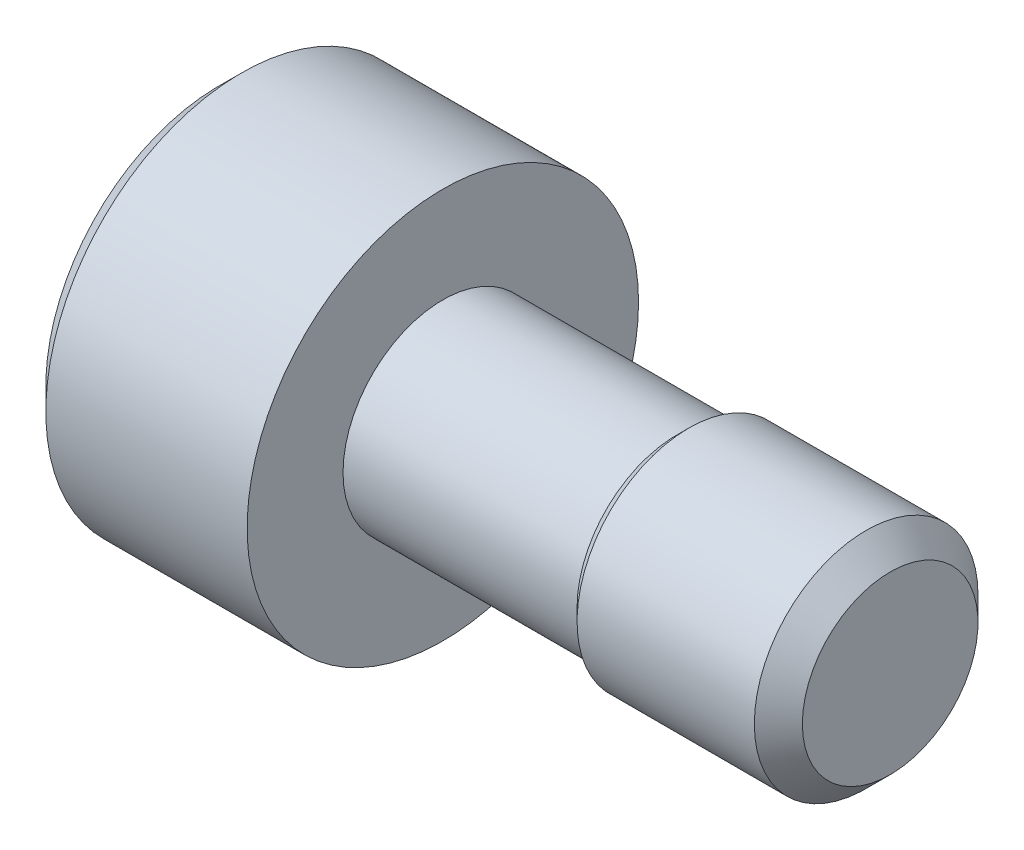
ISO-10303-21;
HEADER;
FILE_DESCRIPTION(('STEP AP214'),'2;1');
FILE_NAME('part.step','',(''),(''),'','','');
FILE_SCHEMA(('AUTOMOTIVE_DESIGN { 1 0 10303 214 1 1 1 1 }'));
ENDSEC;
DATA;
#1=APPLICATION_CONTEXT('core data for automotive mechanical design processes');
#2=APPLICATION_PROTOCOL_DEFINITION('international standard','automotive_design',2000,#1);
#3=PRODUCT_CONTEXT('',#1,'mechanical');
#4=PRODUCT('Part','Part','',(#3));
#5=PRODUCT_RELATED_PRODUCT_CATEGORY('part','',(#4));
#6=PRODUCT_DEFINITION_FORMATION('','',#4);
#7=PRODUCT_DEFINITION_CONTEXT('part definition',#1,'design');
#8=PRODUCT_DEFINITION('design','',#6,#7);
#9=PRODUCT_DEFINITION_SHAPE('','',#8);
#10=(LENGTH_UNIT() NAMED_UNIT(*) SI_UNIT(.MILLI.,.METRE.));
#11=(NAMED_UNIT(*) PLANE_ANGLE_UNIT() SI_UNIT($,.RADIAN.));
#12=(NAMED_UNIT(*) SI_UNIT($,.STERADIAN.) SOLID_ANGLE_UNIT());
#13=UNCERTAINTY_MEASURE_WITH_UNIT(LENGTH_MEASURE(1.E-05),#10,'distance_accuracy_value','');
#14=(GEOMETRIC_REPRESENTATION_CONTEXT(3) GLOBAL_UNCERTAINTY_ASSIGNED_CONTEXT((#13)) GLOBAL_UNIT_ASSIGNED_CONTEXT((#10,
#11,#12)) REPRESENTATION_CONTEXT('',''));
#15=CARTESIAN_POINT('',(0.,0.,0.));
#16=DIRECTION('',(0.,0.,1.));
#17=DIRECTION('',(1.,0.,0.));
#18=AXIS2_PLACEMENT_3D('',#15,#16,#17);
#19=CARTESIAN_POINT('',(8.,0.78525,0.));
#20=DIRECTION('',(1.,0.,0.));
#21=DIRECTION('',(0.,0.,-1.));
#22=AXIS2_PLACEMENT_3D('',#19,#20,#21);
#23=PLANE('',#22);
#24=CARTESIAN_POINT('',(7.99999999992451,0.,0.));
#25=DIRECTION('',(-1.,0.,0.));
#26=DIRECTION('',(0.,0.,1.));
#27=AXIS2_PLACEMENT_3D('',#24,#25,#26);
#28=CIRCLE('',#27,1.57050000001391);
#29=CARTESIAN_POINT('',(7.99999999992451,0.,1.57050000001391));
#30=VERTEX_POINT('',#29);
#31=EDGE_CURVE('E127',#30,#30,#28,.T.);
#32=ORIENTED_EDGE('',*,*,#31,.F.);
#33=EDGE_LOOP('',(#32));
#34=FACE_BOUND('',#33,.T.);
#35=ADVANCED_FACE('F17',(#34),#23,.T.);
#36=CARTESIAN_POINT('',(-2.,0.,0.));
#37=DIRECTION('',(1.,0.,0.));
#38=DIRECTION('',(0.,0.,-1.));
#39=AXIS2_PLACEMENT_3D('',#36,#37,#38);
#40=PLANE('',#39);
#41=DIRECTION('',(0.,1.,0.));
#42=VECTOR('',#41,1.);
#43=CARTESIAN_POINT('',(-2.,0.866025403784439,-1.5));
#44=LINE('',#43,#42);
#45=CARTESIAN_POINT('',(-2.00000000004199,0.,-1.50000000001069));
#46=VERTEX_POINT('',#45);
#47=CARTESIAN_POINT('',(-2.,-0.866025403784439,-1.5));
#48=VERTEX_POINT('',#47);
#49=EDGE_CURVE('E108',#46,#48,#44,.F.);
#50=ORIENTED_EDGE('',*,*,#49,.T.);
#51=DIRECTION('',(0.,0.5,-0.866025403784439));
#52=VECTOR('',#51,1.);
#53=CARTESIAN_POINT('',(-2.,-0.866025403784439,-1.5));
#54=LINE('',#53,#52);
#55=CARTESIAN_POINT('',(-2.00000000004199,-1.29903810568591,-0.750000000005343));
#56=VERTEX_POINT('',#55);
#57=EDGE_CURVE('E104',#48,#56,#54,.F.);
#58=ORIENTED_EDGE('',*,*,#57,.T.);
#59=CARTESIAN_POINT('',(-2.00000000008398,0.,0.));
#60=DIRECTION('',(-1.,0.,0.));
#61=DIRECTION('',(0.,0.,1.));
#62=AXIS2_PLACEMENT_3D('',#59,#60,#61);
#63=CIRCLE('',#62,1.50000000002137);
#64=EDGE_CURVE('E20',#56,#46,#63,.F.);
#65=ORIENTED_EDGE('',*,*,#64,.T.);
#66=EDGE_LOOP('',(#50,#58,#65));
#67=FACE_BOUND('',#66,.T.);
#68=ADVANCED_FACE('F105',(#67),#40,.F.);
#69=CARTESIAN_POINT('',(-2.,0.,0.));
#70=DIRECTION('',(1.,0.,0.));
#71=DIRECTION('',(0.,0.,-1.));
#72=AXIS2_PLACEMENT_3D('',#69,#70,#71);
#73=PLANE('',#72);
#74=DIRECTION('',(0.,0.5,0.866025403784439));
#75=VECTOR('',#74,1.);
#76=CARTESIAN_POINT('',(-2.,1.73205080756888,0.));
#77=LINE('',#76,#75);
#78=CARTESIAN_POINT('',(-2.00000000004199,1.29903810568591,-0.750000000005343));
#79=VERTEX_POINT('',#78);
#80=CARTESIAN_POINT('',(-2.,0.866025403784441,-1.5));
#81=VERTEX_POINT('',#80);
#82=EDGE_CURVE('E156',#79,#81,#77,.F.);
#83=ORIENTED_EDGE('',*,*,#82,.T.);
#84=DIRECTION('',(0.,1.,0.));
#85=VECTOR('',#84,1.);
#86=CARTESIAN_POINT('',(-2.,0.866025403784439,-1.5));
#87=LINE('',#86,#85);
#88=EDGE_CURVE('E124',#81,#46,#87,.F.);
#89=ORIENTED_EDGE('',*,*,#88,.T.);
#90=CARTESIAN_POINT('',(-2.00000000008398,0.,0.));
#91=DIRECTION('',(-1.,0.,0.));
#92=DIRECTION('',(0.,0.,1.));
#93=AXIS2_PLACEMENT_3D('',#90,#91,#92);
#94=CIRCLE('',#93,1.50000000002137);
#95=EDGE_CURVE('E122',#79,#46,#94,.T.);
#96=ORIENTED_EDGE('',*,*,#95,.F.);
#97=EDGE_LOOP('',(#83,#89,#96));
#98=FACE_BOUND('',#97,.T.);
#99=ADVANCED_FACE('F226',(#98),#73,.F.);
#100=CARTESIAN_POINT('',(-4.,0.866025403784439,-1.5));
#101=DIRECTION('',(0.,0.,-1.));
#102=DIRECTION('',(-1.,0.,0.));
#103=AXIS2_PLACEMENT_3D('',#100,#101,#102);
#104=PLANE('',#103);
#105=DIRECTION('',(1.,0.,0.));
#106=VECTOR('',#105,1.);
#107=CARTESIAN_POINT('',(-4.,-0.866025403784439,-1.5));
#108=LINE('',#107,#106);
#109=CARTESIAN_POINT('',(-4.,-0.866025403784439,-1.5));
#110=VERTEX_POINT('',#109);
#111=EDGE_CURVE('E113',#110,#48,#108,.T.);
#112=ORIENTED_EDGE('',*,*,#111,.T.);
#113=ORIENTED_EDGE('',*,*,#49,.F.);
#114=ORIENTED_EDGE('',*,*,#88,.F.);
#115=DIRECTION('',(1.,0.,0.));
#116=VECTOR('',#115,1.);
#117=CARTESIAN_POINT('',(-4.,0.866025403784441,-1.5));
#118=LINE('',#117,#116);
#119=CARTESIAN_POINT('',(-4.,0.86602540378444,-1.5));
#120=VERTEX_POINT('',#119);
#121=EDGE_CURVE('E151',#81,#120,#118,.F.);
#122=ORIENTED_EDGE('',*,*,#121,.T.);
#123=DIRECTION('',(0.,1.,0.));
#124=VECTOR('',#123,1.);
#125=CARTESIAN_POINT('',(-4.,0.866025403784439,-1.5));
#126=LINE('',#125,#124);
#127=EDGE_CURVE('E129',#110,#120,#126,.T.);
#128=ORIENTED_EDGE('',*,*,#127,.F.);
#129=EDGE_LOOP('',(#112,#113,#114,#122,#128));
#130=FACE_BOUND('',#129,.T.);
#131=ADVANCED_FACE('F217',(#130),#104,.F.);
#132=CARTESIAN_POINT('',(7.57050000004256,0.,0.));
#133=DIRECTION('',(-1.,0.,0.));
#134=DIRECTION('',(0.,0.,1.));
#135=AXIS2_PLACEMENT_3D('',#132,#133,#134);
#136=CONICAL_SURFACE('',#135,1.99999999995271,0.785398163463622);
#137=CARTESIAN_POINT('',(7.5705,0.,0.));
#138=DIRECTION('',(1.,0.,0.));
#139=DIRECTION('',(0.,0.,-1.));
#140=AXIS2_PLACEMENT_3D('',#137,#138,#139);
#141=CIRCLE('',#140,2.);
#142=CARTESIAN_POINT('',(7.5705,0.,-2.));
#143=VERTEX_POINT('',#142);
#144=EDGE_CURVE('E150',#143,#143,#141,.F.);
#145=ORIENTED_EDGE('',*,*,#144,.F.);
#146=EDGE_LOOP('',(#145));
#147=FACE_BOUND('',#146,.T.);
#148=ORIENTED_EDGE('',*,*,#31,.T.);
#149=EDGE_LOOP('',(#148));
#150=FACE_BOUND('',#149,.T.);
#151=ADVANCED_FACE('F214',(#147,#150),#136,.T.);
#152=CARTESIAN_POINT('',(-4.,-0.866025403784439,-1.5));
#153=DIRECTION('',(0.,-0.866025403784439,-0.5));
#154=DIRECTION('',(0.,0.5,-0.866025403784439));
#155=AXIS2_PLACEMENT_3D('',#152,#153,#154);
#156=PLANE('',#155);
#157=DIRECTION('',(1.,0.,0.));
#158=VECTOR('',#157,1.);
#159=CARTESIAN_POINT('',(-4.,-1.73205080756888,0.));
#160=LINE('',#159,#158);
#161=CARTESIAN_POINT('',(-4.,-1.73205080756888,0.));
#162=VERTEX_POINT('',#161);
#163=CARTESIAN_POINT('',(-2.,-1.73205080756888,0.));
#164=VERTEX_POINT('',#163);
#165=EDGE_CURVE('E117',#162,#164,#160,.T.);
#166=ORIENTED_EDGE('',*,*,#165,.T.);
#167=DIRECTION('',(0.,0.500000000000001,-0.866025403784438));
#168=VECTOR('',#167,1.);
#169=CARTESIAN_POINT('',(-2.,-1.73205080756888,0.));
#170=LINE('',#169,#168);
#171=EDGE_CURVE('E92',#164,#56,#170,.T.);
#172=ORIENTED_EDGE('',*,*,#171,.T.);
#173=ORIENTED_EDGE('',*,*,#57,.F.);
#174=ORIENTED_EDGE('',*,*,#111,.F.);
#175=DIRECTION('',(0.,0.5,-0.866025403784439));
#176=VECTOR('',#175,1.);
#177=CARTESIAN_POINT('',(-4.,-0.866025403784439,-1.5));
#178=LINE('',#177,#176);
#179=EDGE_CURVE('E112',#162,#110,#178,.T.);
#180=ORIENTED_EDGE('',*,*,#179,.F.);
#181=EDGE_LOOP('',(#166,#172,#173,#174,#180));
#182=FACE_BOUND('',#181,.T.);
#183=ADVANCED_FACE('F115',(#182),#156,.F.);
#184=CARTESIAN_POINT('',(-2.,0.,0.));
#185=DIRECTION('',(1.,0.,0.));
#186=DIRECTION('',(0.,0.,-1.));
#187=AXIS2_PLACEMENT_3D('',#184,#185,#186);
#188=PLANE('',#187);
#189=ORIENTED_EDGE('',*,*,#171,.F.);
#190=DIRECTION('',(0.,-0.5,-0.866025403784439));
#191=VECTOR('',#190,1.);
#192=CARTESIAN_POINT('',(-2.,-1.73205080756888,0.));
#193=LINE('',#192,#191);
#194=CARTESIAN_POINT('',(-2.00000000004199,-1.29903810568591,0.750000000005343));
#195=VERTEX_POINT('',#194);
#196=EDGE_CURVE('E94',#164,#195,#193,.F.);
#197=ORIENTED_EDGE('',*,*,#196,.T.);
#198=CARTESIAN_POINT('',(-2.00000000008398,0.,0.));
#199=DIRECTION('',(-1.,0.,0.));
#200=DIRECTION('',(0.,0.,1.));
#201=AXIS2_PLACEMENT_3D('',#198,#199,#200);
#202=CIRCLE('',#201,1.50000000002137);
#203=EDGE_CURVE('E88',#195,#56,#202,.F.);
#204=ORIENTED_EDGE('',*,*,#203,.T.);
#205=EDGE_LOOP('',(#189,#197,#204));
#206=FACE_BOUND('',#205,.T.);
#207=ADVANCED_FACE('F90',(#206),#188,.F.);
#208=CARTESIAN_POINT('',(-1.99999999995271,0.,0.));
#209=DIRECTION('',(-1.,0.,0.));
#210=DIRECTION('',(0.,0.,1.));
#211=AXIS2_PLACEMENT_3D('',#208,#209,#210);
#212=CONICAL_SURFACE('',#211,1.499999999794,1.04719755099793);
#213=CARTESIAN_POINT('',(-2.00000000008398,0.,0.));
#214=DIRECTION('',(-1.,0.,0.));
#215=DIRECTION('',(0.,0.,1.));
#216=AXIS2_PLACEMENT_3D('',#213,#214,#215);
#217=CIRCLE('',#216,1.50000000002137);
#218=CARTESIAN_POINT('',(-2.00000000004199,1.29903810568591,0.750000000005342));
#219=VERTEX_POINT('',#218);
#220=EDGE_CURVE('E99',#219,#79,#217,.T.);
#221=ORIENTED_EDGE('',*,*,#220,.T.);
#222=ORIENTED_EDGE('',*,*,#95,.T.);
#223=ORIENTED_EDGE('',*,*,#64,.F.);
#224=ORIENTED_EDGE('',*,*,#203,.F.);
#225=CARTESIAN_POINT('',(-2.00000000008398,0.,0.));
#226=DIRECTION('',(-1.,0.,0.));
#227=DIRECTION('',(0.,0.,1.));
#228=AXIS2_PLACEMENT_3D('',#225,#226,#227);
#229=CIRCLE('',#228,1.50000000002137);
#230=CARTESIAN_POINT('',(-2.00000000004199,0.,1.50000000001069));
#231=VERTEX_POINT('',#230);
#232=EDGE_CURVE('E133',#195,#231,#229,.T.);
#233=ORIENTED_EDGE('',*,*,#232,.T.);
#234=CARTESIAN_POINT('',(-2.00000000008398,0.,0.));
#235=DIRECTION('',(-1.,0.,0.));
#236=DIRECTION('',(0.,0.,1.));
#237=AXIS2_PLACEMENT_3D('',#234,#235,#236);
#238=CIRCLE('',#237,1.50000000002137);
#239=EDGE_CURVE('E135',#231,#219,#238,.T.);
#240=ORIENTED_EDGE('',*,*,#239,.T.);
#241=EDGE_LOOP('',(#221,#222,#223,#224,#233,#240));
#242=FACE_BOUND('',#241,.T.);
#243=CARTESIAN_POINT('',(-1.13397459617204,2.55795384873636E-10,0.));
#244=VERTEX_POINT('',#243);
#245=VERTEX_LOOP('',#244);
#246=FACE_BOUND('',#245,.T.);
#247=ADVANCED_FACE('F119',(#242,#246),#212,.F.);
#248=CARTESIAN_POINT('',(-2.,0.,0.));
#249=DIRECTION('',(1.,0.,0.));
#250=DIRECTION('',(0.,0.,-1.));
#251=AXIS2_PLACEMENT_3D('',#248,#249,#250);
#252=PLANE('',#251);
#253=DIRECTION('',(0.,-0.5,0.866025403784439));
#254=VECTOR('',#253,1.);
#255=CARTESIAN_POINT('',(-2.,0.866025403784439,1.5));
#256=LINE('',#255,#254);
#257=CARTESIAN_POINT('',(-2.,1.73205080756888,0.));
#258=VERTEX_POINT('',#257);
#259=EDGE_CURVE('E169',#219,#258,#256,.F.);
#260=ORIENTED_EDGE('',*,*,#259,.T.);
#261=DIRECTION('',(0.,0.5,0.866025403784439));
#262=VECTOR('',#261,1.);
#263=CARTESIAN_POINT('',(-2.,1.73205080756888,0.));
#264=LINE('',#263,#262);
#265=EDGE_CURVE('E132',#258,#79,#264,.F.);
#266=ORIENTED_EDGE('',*,*,#265,.T.);
#267=ORIENTED_EDGE('',*,*,#220,.F.);
#268=EDGE_LOOP('',(#260,#266,#267));
#269=FACE_BOUND('',#268,.T.);
#270=ADVANCED_FACE('F269',(#269),#252,.F.);
#271=CARTESIAN_POINT('',(-4.,1.73205080756888,0.));
#272=DIRECTION('',(0.,0.866025403784439,-0.5));
#273=DIRECTION('',(0.,0.5,0.866025403784439));
#274=AXIS2_PLACEMENT_3D('',#271,#272,#273);
#275=PLANE('',#274);
#276=ORIENTED_EDGE('',*,*,#121,.F.);
#277=ORIENTED_EDGE('',*,*,#82,.F.);
#278=ORIENTED_EDGE('',*,*,#265,.F.);
#279=DIRECTION('',(1.,0.,0.));
#280=VECTOR('',#279,1.);
#281=CARTESIAN_POINT('',(-4.,1.73205080756888,0.));
#282=LINE('',#281,#280);
#283=CARTESIAN_POINT('',(-4.,1.73205080756888,0.));
#284=VERTEX_POINT('',#283);
#285=EDGE_CURVE('E166',#258,#284,#282,.F.);
#286=ORIENTED_EDGE('',*,*,#285,.T.);
#287=DIRECTION('',(0.,0.5,0.866025403784439));
#288=VECTOR('',#287,1.);
#289=CARTESIAN_POINT('',(-4.,1.73205080756888,0.));
#290=LINE('',#289,#288);
#291=EDGE_CURVE('E148',#120,#284,#290,.T.);
#292=ORIENTED_EDGE('',*,*,#291,.F.);
#293=EDGE_LOOP('',(#276,#277,#278,#286,#292));
#294=FACE_BOUND('',#293,.T.);
#295=ADVANCED_FACE('F210',(#294),#275,.F.);
#296=CARTESIAN_POINT('',(5.98525,0.,0.));
#297=DIRECTION('',(1.,0.,0.));
#298=DIRECTION('',(0.,0.,-1.));
#299=AXIS2_PLACEMENT_3D('',#296,#297,#298);
#300=CYLINDRICAL_SURFACE('',#299,2.);
#301=CARTESIAN_POINT('',(4.39999999997553,0.,0.));
#302=DIRECTION('',(1.,0.,0.));
#303=DIRECTION('',(0.,1.,0.));
#304=AXIS2_PLACEMENT_3D('',#301,#302,#303);
#305=CIRCLE('',#304,2.00000000000955);
#306=CARTESIAN_POINT('',(4.39999999997553,2.00000000000955,0.));
#307=VERTEX_POINT('',#306);
#308=EDGE_CURVE('E173',#307,#307,#305,.F.);
#309=ORIENTED_EDGE('',*,*,#308,.F.);
#310=EDGE_LOOP('',(#309));
#311=FACE_BOUND('',#310,.T.);
#312=ORIENTED_EDGE('',*,*,#144,.T.);
#313=EDGE_LOOP('',(#312));
#314=FACE_BOUND('',#313,.T.);
#315=ADVANCED_FACE('F206',(#311,#314),#300,.T.);
#316=CARTESIAN_POINT('',(-4.,-1.73205080756888,0.));
#317=DIRECTION('',(0.,-0.866025403784439,0.5));
#318=DIRECTION('',(0.,-0.5,-0.866025403784439));
#319=AXIS2_PLACEMENT_3D('',#316,#317,#318);
#320=PLANE('',#319);
#321=DIRECTION('',(1.,0.,0.));
#322=VECTOR('',#321,1.);
#323=CARTESIAN_POINT('',(-4.,-0.866025403784439,1.5));
#324=LINE('',#323,#322);
#325=CARTESIAN_POINT('',(-4.,-0.86602540378444,1.5));
#326=VERTEX_POINT('',#325);
#327=CARTESIAN_POINT('',(-2.,-0.866025403784439,1.5));
#328=VERTEX_POINT('',#327);
#329=EDGE_CURVE('E176',#326,#328,#324,.T.);
#330=ORIENTED_EDGE('',*,*,#329,.T.);
#331=DIRECTION('',(0.,-0.500000000000001,-0.866025403784438));
#332=VECTOR('',#331,1.);
#333=CARTESIAN_POINT('',(-2.,-0.866025403784439,1.5));
#334=LINE('',#333,#332);
#335=EDGE_CURVE('E136',#328,#195,#334,.T.);
#336=ORIENTED_EDGE('',*,*,#335,.T.);
#337=ORIENTED_EDGE('',*,*,#196,.F.);
#338=ORIENTED_EDGE('',*,*,#165,.F.);
#339=DIRECTION('',(0.,-0.5,-0.866025403784439));
#340=VECTOR('',#339,1.);
#341=CARTESIAN_POINT('',(-4.,-1.73205080756888,0.));
#342=LINE('',#341,#340);
#343=EDGE_CURVE('E165',#326,#162,#342,.T.);
#344=ORIENTED_EDGE('',*,*,#343,.F.);
#345=EDGE_LOOP('',(#330,#336,#337,#338,#344));
#346=FACE_BOUND('',#345,.T.);
#347=ADVANCED_FACE('F209',(#346),#320,.F.);
#348=CARTESIAN_POINT('',(-2.,0.,0.));
#349=DIRECTION('',(1.,0.,0.));
#350=DIRECTION('',(0.,0.,-1.));
#351=AXIS2_PLACEMENT_3D('',#348,#349,#350);
#352=PLANE('',#351);
#353=ORIENTED_EDGE('',*,*,#335,.F.);
#354=DIRECTION('',(0.,1.,0.));
#355=VECTOR('',#354,1.);
#356=CARTESIAN_POINT('',(-2.,-0.866025403784439,1.5));
#357=LINE('',#356,#355);
#358=EDGE_CURVE('E182',#328,#231,#357,.T.);
#359=ORIENTED_EDGE('',*,*,#358,.T.);
#360=ORIENTED_EDGE('',*,*,#232,.F.);
#361=EDGE_LOOP('',(#353,#359,#360));
#362=FACE_BOUND('',#361,.T.);
#363=ADVANCED_FACE('F259',(#362),#352,.F.);
#364=CARTESIAN_POINT('',(-2.,0.,0.));
#365=DIRECTION('',(1.,0.,0.));
#366=DIRECTION('',(0.,0.,-1.));
#367=AXIS2_PLACEMENT_3D('',#364,#365,#366);
#368=PLANE('',#367);
#369=DIRECTION('',(0.,1.,0.));
#370=VECTOR('',#369,1.);
#371=CARTESIAN_POINT('',(-2.,-0.866025403784439,1.5));
#372=LINE('',#371,#370);
#373=CARTESIAN_POINT('',(-2.,0.866025403784439,1.5));
#374=VERTEX_POINT('',#373);
#375=EDGE_CURVE('E186',#231,#374,#372,.T.);
#376=ORIENTED_EDGE('',*,*,#375,.T.);
#377=DIRECTION('',(0.,-0.5,0.866025403784439));
#378=VECTOR('',#377,1.);
#379=CARTESIAN_POINT('',(-2.,0.866025403784439,1.5));
#380=LINE('',#379,#378);
#381=EDGE_CURVE('E138',#374,#219,#380,.F.);
#382=ORIENTED_EDGE('',*,*,#381,.T.);
#383=ORIENTED_EDGE('',*,*,#239,.F.);
#384=EDGE_LOOP('',(#376,#382,#383));
#385=FACE_BOUND('',#384,.T.);
#386=ADVANCED_FACE('F255',(#385),#368,.F.);
#387=CARTESIAN_POINT('',(-4.,0.866025403784439,1.5));
#388=DIRECTION('',(0.,0.866025403784439,0.5));
#389=DIRECTION('',(0.,-0.5,0.866025403784439));
#390=AXIS2_PLACEMENT_3D('',#387,#388,#389);
#391=PLANE('',#390);
#392=ORIENTED_EDGE('',*,*,#285,.F.);
#393=ORIENTED_EDGE('',*,*,#259,.F.);
#394=ORIENTED_EDGE('',*,*,#381,.F.);
#395=DIRECTION('',(1.,0.,0.));
#396=VECTOR('',#395,1.);
#397=CARTESIAN_POINT('',(-4.,0.866025403784439,1.5));
#398=LINE('',#397,#396);
#399=CARTESIAN_POINT('',(-4.,0.866025403784439,1.5));
#400=VERTEX_POINT('',#399);
#401=EDGE_CURVE('E184',#374,#400,#398,.F.);
#402=ORIENTED_EDGE('',*,*,#401,.T.);
#403=DIRECTION('',(0.,-0.5,0.866025403784439));
#404=VECTOR('',#403,1.);
#405=CARTESIAN_POINT('',(-4.,0.866025403784439,1.5));
#406=LINE('',#405,#404);
#407=EDGE_CURVE('E35',#284,#400,#406,.T.);
#408=ORIENTED_EDGE('',*,*,#407,.F.);
#409=EDGE_LOOP('',(#392,#393,#394,#402,#408));
#410=FACE_BOUND('',#409,.T.);
#411=ADVANCED_FACE('F202',(#410),#391,.F.);
#412=CARTESIAN_POINT('',(4.39999999997553,0.,0.));
#413=DIRECTION('',(1.,0.,0.));
#414=DIRECTION('',(0.,0.,-1.));
#415=AXIS2_PLACEMENT_3D('',#412,#413,#414);
#416=CONICAL_SURFACE('',#415,2.00000000000955,0.785398163397448);
#417=CARTESIAN_POINT('',(4.18498275,0.,0.));
#418=DIRECTION('',(1.,0.,0.));
#419=DIRECTION('',(0.,0.,-1.));
#420=AXIS2_PLACEMENT_3D('',#417,#418,#419);
#421=CIRCLE('',#420,1.78498275);
#422=CARTESIAN_POINT('',(4.18498275,0.,-1.78498275));
#423=VERTEX_POINT('',#422);
#424=EDGE_CURVE('E178',#423,#423,#421,.F.);
#425=ORIENTED_EDGE('',*,*,#424,.F.);
#426=EDGE_LOOP('',(#425));
#427=FACE_BOUND('',#426,.T.);
#428=ORIENTED_EDGE('',*,*,#308,.T.);
#429=EDGE_LOOP('',(#428));
#430=FACE_BOUND('',#429,.T.);
#431=ADVANCED_FACE('F198',(#427,#430),#416,.T.);
#432=CARTESIAN_POINT('',(-4.,-0.866025403784439,1.5));
#433=DIRECTION('',(0.,0.,1.));
#434=DIRECTION('',(1.,0.,0.));
#435=AXIS2_PLACEMENT_3D('',#432,#433,#434);
#436=PLANE('',#435);
#437=ORIENTED_EDGE('',*,*,#401,.F.);
#438=ORIENTED_EDGE('',*,*,#375,.F.);
#439=ORIENTED_EDGE('',*,*,#358,.F.);
#440=ORIENTED_EDGE('',*,*,#329,.F.);
#441=DIRECTION('',(0.,1.,0.));
#442=VECTOR('',#441,1.);
#443=CARTESIAN_POINT('',(-4.,2.3,1.5));
#444=LINE('',#443,#442);
#445=EDGE_CURVE('E143',#400,#326,#444,.F.);
#446=ORIENTED_EDGE('',*,*,#445,.F.);
#447=EDGE_LOOP('',(#437,#438,#439,#440,#446));
#448=FACE_BOUND('',#447,.T.);
#449=ADVANCED_FACE('F201',(#448),#436,.F.);
#450=CARTESIAN_POINT('',(2.092491375,0.,0.));
#451=DIRECTION('',(1.,0.,0.));
#452=DIRECTION('',(0.,0.,-1.));
#453=AXIS2_PLACEMENT_3D('',#450,#451,#452);
#454=CYLINDRICAL_SURFACE('',#453,1.78498275);
#455=CARTESIAN_POINT('',(0.,0.,0.));
#456=DIRECTION('',(1.,0.,0.));
#457=DIRECTION('',(0.,0.,-1.));
#458=AXIS2_PLACEMENT_3D('',#455,#456,#457);
#459=CIRCLE('',#458,1.78498275);
#460=CARTESIAN_POINT('',(0.,0.,-1.78498275));
#461=VERTEX_POINT('',#460);
#462=EDGE_CURVE('E139',#461,#461,#459,.F.);
#463=ORIENTED_EDGE('',*,*,#462,.F.);
#464=EDGE_LOOP('',(#463));
#465=FACE_BOUND('',#464,.T.);
#466=ORIENTED_EDGE('',*,*,#424,.T.);
#467=EDGE_LOOP('',(#466));
#468=FACE_BOUND('',#467,.T.);
#469=ADVANCED_FACE('F196',(#465,#468),#454,.T.);
#470=CARTESIAN_POINT('',(-4.,2.3,0.));
#471=DIRECTION('',(-1.,0.,0.));
#472=DIRECTION('',(0.,0.,1.));
#473=AXIS2_PLACEMENT_3D('',#470,#471,#472);
#474=PLANE('',#473);
#475=CARTESIAN_POINT('',(-4.0000000000191,0.,0.));
#476=DIRECTION('',(1.,0.,0.));
#477=DIRECTION('',(0.,0.,-1.));
#478=AXIS2_PLACEMENT_3D('',#475,#476,#477);
#479=CIRCLE('',#478,3.10000000001764);
#480=CARTESIAN_POINT('',(-4.0000000000191,0.,-3.10000000001764));
#481=VERTEX_POINT('',#480);
#482=EDGE_CURVE('E142',#481,#481,#479,.T.);
#483=ORIENTED_EDGE('',*,*,#482,.F.);
#484=EDGE_LOOP('',(#483));
#485=FACE_BOUND('',#484,.T.);
#486=ORIENTED_EDGE('',*,*,#407,.T.);
#487=ORIENTED_EDGE('',*,*,#445,.T.);
#488=ORIENTED_EDGE('',*,*,#343,.T.);
#489=ORIENTED_EDGE('',*,*,#179,.T.);
#490=ORIENTED_EDGE('',*,*,#127,.T.);
#491=ORIENTED_EDGE('',*,*,#291,.T.);
#492=EDGE_LOOP('',(#486,#487,#488,#489,#490,#491));
#493=FACE_BOUND('',#492,.T.);
#494=ADVANCED_FACE('F242',(#485,#493),#474,.T.);
#495=CARTESIAN_POINT('',(0.,2.642491375,0.));
#496=DIRECTION('',(1.,0.,0.));
#497=DIRECTION('',(0.,0.,-1.));
#498=AXIS2_PLACEMENT_3D('',#495,#496,#497);
#499=PLANE('',#498);
#500=ORIENTED_EDGE('',*,*,#462,.T.);
#501=EDGE_LOOP('',(#500));
#502=FACE_BOUND('',#501,.T.);
#503=CARTESIAN_POINT('',(0.,0.,0.));
#504=DIRECTION('',(1.,0.,0.));
#505=DIRECTION('',(0.,0.,-1.));
#506=AXIS2_PLACEMENT_3D('',#503,#504,#505);
#507=CIRCLE('',#506,3.5);
#508=CARTESIAN_POINT('',(0.,0.,-3.5));
#509=VERTEX_POINT('',#508);
#510=EDGE_CURVE('E26',#509,#509,#507,.F.);
#511=ORIENTED_EDGE('',*,*,#510,.F.);
#512=EDGE_LOOP('',(#511));
#513=FACE_BOUND('',#512,.T.);
#514=ADVANCED_FACE('F235',(#502,#513),#499,.T.);
#515=CARTESIAN_POINT('',(-3.60000000000582,0.,0.));
#516=DIRECTION('',(1.,0.,0.));
#517=DIRECTION('',(0.,0.,-1.));
#518=AXIS2_PLACEMENT_3D('',#515,#516,#517);
#519=CONICAL_SURFACE('',#518,3.50000000003092,0.785398163397448);
#520=ORIENTED_EDGE('',*,*,#482,.T.);
#521=EDGE_LOOP('',(#520));
#522=FACE_BOUND('',#521,.T.);
#523=CARTESIAN_POINT('',(-3.6,0.,0.));
#524=DIRECTION('',(1.,0.,0.));
#525=DIRECTION('',(0.,0.,-1.));
#526=AXIS2_PLACEMENT_3D('',#523,#524,#525);
#527=CIRCLE('',#526,3.5);
#528=CARTESIAN_POINT('',(-3.6,0.,-3.5));
#529=VERTEX_POINT('',#528);
#530=EDGE_CURVE('E11',#529,#529,#527,.T.);
#531=ORIENTED_EDGE('',*,*,#530,.F.);
#532=EDGE_LOOP('',(#531));
#533=FACE_BOUND('',#532,.T.);
#534=ADVANCED_FACE('F229',(#522,#533),#519,.T.);
#535=CARTESIAN_POINT('',(-1.8,0.,0.));
#536=DIRECTION('',(1.,0.,0.));
#537=DIRECTION('',(0.,0.,-1.));
#538=AXIS2_PLACEMENT_3D('',#535,#536,#537);
#539=CYLINDRICAL_SURFACE('',#538,3.5);
#540=ORIENTED_EDGE('',*,*,#510,.T.);
#541=EDGE_LOOP('',(#540));
#542=FACE_BOUND('',#541,.T.);
#543=ORIENTED_EDGE('',*,*,#530,.T.);
#544=EDGE_LOOP('',(#543));
#545=FACE_BOUND('',#544,.T.);
#546=ADVANCED_FACE('F227',(#542,#545),#539,.T.);
#547=CLOSED_SHELL('',(#35,#68,#99,#131,#151,#183,#207,#247,#270,#295,#315,#347,#363,#386,#411,
#431,#449,#469,#494,#514,#534,#546));
#548=MANIFOLD_SOLID_BREP('B1',#547);
#549=ADVANCED_BREP_SHAPE_REPRESENTATION('',(#18,#548),#14);
#550=SHAPE_DEFINITION_REPRESENTATION(#9,#549);
ENDSEC;
END-ISO-10303-21;
